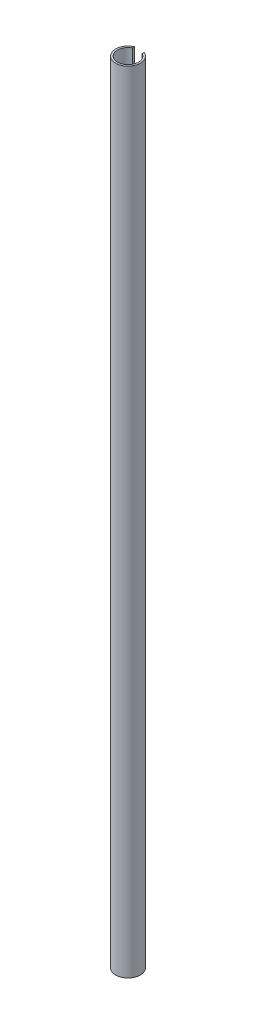
ISO-10303-21;
HEADER;
FILE_DESCRIPTION(('STEP AP214'),'2;1');
FILE_NAME('part.step','',(''),(''),'','','');
FILE_SCHEMA(('AUTOMOTIVE_DESIGN { 1 0 10303 214 1 1 1 1 }'));
ENDSEC;
DATA;
#1=APPLICATION_CONTEXT('core data for automotive mechanical design processes');
#2=APPLICATION_PROTOCOL_DEFINITION('international standard','automotive_design',2000,#1);
#3=PRODUCT_CONTEXT('',#1,'mechanical');
#4=PRODUCT('Part','Part','',(#3));
#5=PRODUCT_RELATED_PRODUCT_CATEGORY('part','',(#4));
#6=PRODUCT_DEFINITION_FORMATION('','',#4);
#7=PRODUCT_DEFINITION_CONTEXT('part definition',#1,'design');
#8=PRODUCT_DEFINITION('design','',#6,#7);
#9=PRODUCT_DEFINITION_SHAPE('','',#8);
#10=(LENGTH_UNIT() NAMED_UNIT(*) SI_UNIT(.MILLI.,.METRE.));
#11=(NAMED_UNIT(*) PLANE_ANGLE_UNIT() SI_UNIT($,.RADIAN.));
#12=(NAMED_UNIT(*) SI_UNIT($,.STERADIAN.) SOLID_ANGLE_UNIT());
#13=UNCERTAINTY_MEASURE_WITH_UNIT(LENGTH_MEASURE(1.E-05),#10,'distance_accuracy_value','');
#14=(GEOMETRIC_REPRESENTATION_CONTEXT(3) GLOBAL_UNCERTAINTY_ASSIGNED_CONTEXT((#13)) GLOBAL_UNIT_ASSIGNED_CONTEXT((#10,
#11,#12)) REPRESENTATION_CONTEXT('',''));
#15=CARTESIAN_POINT('',(0.,0.,0.));
#16=DIRECTION('',(0.,0.,1.));
#17=DIRECTION('',(1.,0.,0.));
#18=AXIS2_PLACEMENT_3D('',#15,#16,#17);
#19=CARTESIAN_POINT('',(0.,-304.8,0.));
#20=DIRECTION('',(0.,1.,0.));
#21=DIRECTION('',(0.,0.,1.));
#22=AXIS2_PLACEMENT_3D('',#19,#20,#21);
#23=CYLINDRICAL_SURFACE('',#22,4.7625);
#24=CARTESIAN_POINT('',(0.,-6.35000000000002,0.));
#25=DIRECTION('',(0.,-1.,0.));
#26=DIRECTION('',(0.,0.,-1.));
#27=AXIS2_PLACEMENT_3D('',#24,#25,#26);
#28=CIRCLE('',#27,4.7625);
#29=CARTESIAN_POINT('',(1.27,-6.35000000000002,-4.5900442535993));
#30=VERTEX_POINT('',#29);
#31=CARTESIAN_POINT('',(-1.27,-6.35,-4.5900442535993));
#32=VERTEX_POINT('',#31);
#33=EDGE_CURVE('E147',#30,#32,#28,.F.);
#34=ORIENTED_EDGE('',*,*,#33,.F.);
#35=CARTESIAN_POINT('',(1.905,-5.715,-4.36490334944544));
#36=CARTESIAN_POINT('',(1.90503800002864,-5.74879900199064,-4.36487550763184));
#37=CARTESIAN_POINT('',(1.90230425531174,-5.78256578385883,-4.36607985594003));
#38=CARTESIAN_POINT('',(1.89160065251299,-5.84898467679265,-4.37073365778045));
#39=CARTESIAN_POINT('',(1.88364892991776,-5.88164023799716,-4.37417533491678));
#40=CARTESIAN_POINT('',(1.86281908756131,-5.94501442064823,-4.38308464775235));
#41=CARTESIAN_POINT('',(1.84994386653643,-5.97573416944238,-4.38855109130008));
#42=CARTESIAN_POINT('',(1.81974028845931,-6.03453620737428,-4.40116126099279));
#43=CARTESIAN_POINT('',(1.80240911607355,-6.06261681369124,-4.40830604729126));
#44=CARTESIAN_POINT('',(1.76303357276742,-6.11662890290227,-4.4242045821498));
#45=CARTESIAN_POINT('',(1.74082421411687,-6.14242387415081,-4.43301256122459));
#46=CARTESIAN_POINT('',(1.69278854194413,-6.18999301552871,-4.45157681831055));
#47=CARTESIAN_POINT('',(1.66696087584477,-6.2117656749683,-4.46133345052315));
#48=CARTESIAN_POINT('',(1.61030361574204,-6.25232677797643,-4.48210922071584));
#49=CARTESIAN_POINT('',(1.57924543193752,-6.27077579529577,-4.49316837521271));
#50=CARTESIAN_POINT('',(1.5144977145548,-6.30214525536181,-4.51540411688492));
#51=CARTESIAN_POINT('',(1.48080874248509,-6.3150668740686,-4.52658067856281));
#52=CARTESIAN_POINT('',(1.41772466091862,-6.33329013537011,-4.54668615696082));
#53=CARTESIAN_POINT('',(1.38861347289046,-6.33953103962582,-4.5556653243771));
#54=CARTESIAN_POINT('',(1.32970189125,-6.34788839302279,-4.57321119814704));
#55=CARTESIAN_POINT('',(1.29990186765957,-6.3500070067277,-4.58177811866035));
#56=CARTESIAN_POINT('',(1.27,-6.35,-4.5900442535993));
#57=B_SPLINE_CURVE_WITH_KNOTS('',3,(#35,#36,#37,#38,#39,#40,#41,#42,#43,#44,#45,#46,#47,#48,#49,
#50,#51,#52,#53,#54,#55,#56),.UNSPECIFIED.,.F.,.F.,(4,2,2,2,2,2,2,2,2,2,4),(0.,
0.101214896403329,0.202079862629373,0.302885535264283,0.40375505554581,0.508787236712468,
0.613858785759235,0.726694912733847,0.839507021745022,0.932522619243278,1.02548936221034),.UNSPECIFIED.);
#58=CARTESIAN_POINT('',(1.905,-5.715,-4.36490334944544));
#59=VERTEX_POINT('',#58);
#60=EDGE_CURVE('E102',#59,#30,#57,.T.);
#61=ORIENTED_EDGE('',*,*,#60,.F.);
#62=DIRECTION('',(0.,1.,0.));
#63=VECTOR('',#62,1.);
#64=CARTESIAN_POINT('',(1.90500000000002,-304.8,-4.36490334944543));
#65=LINE('',#64,#63);
#66=CARTESIAN_POINT('',(1.905,0.,-4.36490334944544));
#67=VERTEX_POINT('',#66);
#68=EDGE_CURVE('E89',#67,#59,#65,.F.);
#69=ORIENTED_EDGE('',*,*,#68,.F.);
#70=CARTESIAN_POINT('',(0.,0.,0.));
#71=DIRECTION('',(0.,1.,0.));
#72=DIRECTION('',(0.,0.,1.));
#73=AXIS2_PLACEMENT_3D('',#70,#71,#72);
#74=CIRCLE('',#73,4.7625);
#75=CARTESIAN_POINT('',(-1.905,0.,-4.36490334944544));
#76=VERTEX_POINT('',#75);
#77=EDGE_CURVE('E100',#76,#67,#74,.T.);
#78=ORIENTED_EDGE('',*,*,#77,.F.);
#79=DIRECTION('',(0.,1.,0.));
#80=VECTOR('',#79,1.);
#81=CARTESIAN_POINT('',(-1.90499999999998,-304.8,-4.36490334944545));
#82=LINE('',#81,#80);
#83=CARTESIAN_POINT('',(-1.905,-5.715,-4.36490334944545));
#84=VERTEX_POINT('',#83);
#85=EDGE_CURVE('E148',#84,#76,#82,.T.);
#86=ORIENTED_EDGE('',*,*,#85,.F.);
#87=CARTESIAN_POINT('',(-1.27,-6.35,-4.5900442535993));
#88=CARTESIAN_POINT('',(-1.30743028935149,-6.35002027004708,-4.5797062055525));
#89=CARTESIAN_POINT('',(-1.34469949158554,-6.34669271583312,-4.56888372852702));
#90=CARTESIAN_POINT('',(-1.41790368380758,-6.33364637474788,-4.54668804550818));
#91=CARTESIAN_POINT('',(-1.45383968988314,-6.32393256542177,-4.53531527481231));
#92=CARTESIAN_POINT('',(-1.52342266456396,-6.29841873885982,-4.51242111997901));
#93=CARTESIAN_POINT('',(-1.55706990409318,-6.28261944345029,-4.50089975362376));
#94=CARTESIAN_POINT('',(-1.62119438507204,-6.24534171130319,-4.47820159949489));
#95=CARTESIAN_POINT('',(-1.65167130633011,-6.22386270170786,-4.46702484660613));
#96=CARTESIAN_POINT('',(-1.70871003914993,-6.17560853350087,-4.44552037060821));
#97=CARTESIAN_POINT('',(-1.73525409786868,-6.14881056541491,-4.43519658519313));
#98=CARTESIAN_POINT('',(-1.78339383593601,-6.09060170400478,-4.41605991992178));
#99=CARTESIAN_POINT('',(-1.80498986446577,-6.05919113644739,-4.40724693345989));
#100=CARTESIAN_POINT('',(-1.84149271758497,-5.99418633029293,-4.39211614149731));
#101=CARTESIAN_POINT('',(-1.85666775142898,-5.96076579426649,-4.38569998591317));
#102=CARTESIAN_POINT('',(-1.88107873790394,-5.89149403745904,-4.37528604139458));
#103=CARTESIAN_POINT('',(-1.89032536453664,-5.85564731442351,-4.37128390682803));
#104=CARTESIAN_POINT('',(-1.89925247545882,-5.80201774415863,-4.36740822443793));
#105=CARTESIAN_POINT('',(-1.90140609266565,-5.784688525274,-4.36647050339013));
#106=CARTESIAN_POINT('',(-1.90427918763857,-5.74990962201361,-4.36521802598698));
#107=CARTESIAN_POINT('',(-1.90500032543591,-5.73246010062041,-4.36490254854654));
#108=CARTESIAN_POINT('',(-1.905,-5.715,-4.36490334944544));
#109=B_SPLINE_CURVE_WITH_KNOTS('',3,(#87,#88,#89,#90,#91,#92,#93,#94,#95,#96,#97,#98,#99,#100,
#101,#102,#103,#104,#105,#106,#107,#108),.UNSPECIFIED.,.F.,.F.,(4,2,2,2,2,2,2,2,2,2,4),(0.,
0.116313306071376,0.232536063073277,0.348745038625052,0.464965739524027,0.581696042350367,
0.698418105011242,0.809616036110505,0.920613190677826,0.973015841688996,1.02535773028726),.UNSPECIFIED.);
#110=EDGE_CURVE('E141',#32,#84,#109,.T.);
#111=ORIENTED_EDGE('',*,*,#110,.F.);
#112=EDGE_LOOP('',(#34,#61,#69,#78,#86,#111));
#113=FACE_BOUND('',#112,.T.);
#114=CARTESIAN_POINT('',(0.,-304.8,0.));
#115=DIRECTION('',(0.,1.,0.));
#116=DIRECTION('',(0.,0.,1.));
#117=AXIS2_PLACEMENT_3D('',#114,#115,#116);
#118=CIRCLE('',#117,4.7625);
#119=CARTESIAN_POINT('',(0.,-304.8,4.7625));
#120=VERTEX_POINT('',#119);
#121=EDGE_CURVE('E106',#120,#120,#118,.T.);
#122=ORIENTED_EDGE('',*,*,#121,.T.);
#123=EDGE_LOOP('',(#122));
#124=FACE_BOUND('',#123,.T.);
#125=ADVANCED_FACE('F33',(#113,#124),#23,.T.);
#126=CARTESIAN_POINT('',(0.,-304.8,0.));
#127=DIRECTION('',(0.,1.,0.));
#128=DIRECTION('',(0.,0.,1.));
#129=AXIS2_PLACEMENT_3D('',#126,#127,#128);
#130=PLANE('',#129);
#131=CARTESIAN_POINT('',(0.,-304.8,0.));
#132=DIRECTION('',(0.,1.,0.));
#133=DIRECTION('',(0.,0.,1.));
#134=AXIS2_PLACEMENT_3D('',#131,#132,#133);
#135=CIRCLE('',#134,4.0513);
#136=CARTESIAN_POINT('',(0.,-304.8,4.0513));
#137=VERTEX_POINT('',#136);
#138=EDGE_CURVE('E107',#137,#137,#135,.T.);
#139=ORIENTED_EDGE('',*,*,#138,.T.);
#140=EDGE_LOOP('',(#139));
#141=FACE_BOUND('',#140,.T.);
#142=ORIENTED_EDGE('',*,*,#121,.F.);
#143=EDGE_LOOP('',(#142));
#144=FACE_BOUND('',#143,.T.);
#145=ADVANCED_FACE('F182',(#141,#144),#130,.F.);
#146=CARTESIAN_POINT('',(0.,0.,0.));
#147=DIRECTION('',(0.,1.,0.));
#148=DIRECTION('',(0.,0.,1.));
#149=AXIS2_PLACEMENT_3D('',#146,#147,#148);
#150=PLANE('',#149);
#151=DIRECTION('',(0.,0.,1.));
#152=VECTOR('',#151,1.);
#153=CARTESIAN_POINT('',(1.905,0.,-4.7625));
#154=LINE('',#153,#152);
#155=CARTESIAN_POINT('',(1.905,0.,-3.57547293235454));
#156=VERTEX_POINT('',#155);
#157=EDGE_CURVE('E86',#67,#156,#154,.T.);
#158=ORIENTED_EDGE('',*,*,#157,.T.);
#159=CARTESIAN_POINT('',(0.,0.,0.));
#160=DIRECTION('',(0.,1.,0.));
#161=DIRECTION('',(0.,0.,1.));
#162=AXIS2_PLACEMENT_3D('',#159,#160,#161);
#163=CIRCLE('',#162,4.0513);
#164=CARTESIAN_POINT('',(-1.905,0.,-3.57547293235454));
#165=VERTEX_POINT('',#164);
#166=EDGE_CURVE('E103',#165,#156,#163,.T.);
#167=ORIENTED_EDGE('',*,*,#166,.F.);
#168=DIRECTION('',(0.,0.,1.));
#169=VECTOR('',#168,1.);
#170=CARTESIAN_POINT('',(-1.905,0.,-4.7625));
#171=LINE('',#170,#169);
#172=EDGE_CURVE('E48',#76,#165,#171,.T.);
#173=ORIENTED_EDGE('',*,*,#172,.F.);
#174=ORIENTED_EDGE('',*,*,#77,.T.);
#175=EDGE_LOOP('',(#158,#167,#173,#174));
#176=FACE_BOUND('',#175,.T.);
#177=ADVANCED_FACE('F105',(#176),#150,.T.);
#178=CARTESIAN_POINT('',(0.,-304.8,0.));
#179=DIRECTION('',(0.,1.,0.));
#180=DIRECTION('',(0.,0.,1.));
#181=AXIS2_PLACEMENT_3D('',#178,#179,#180);
#182=CYLINDRICAL_SURFACE('',#181,4.0513);
#183=ORIENTED_EDGE('',*,*,#138,.F.);
#184=EDGE_LOOP('',(#183));
#185=FACE_BOUND('',#184,.T.);
#186=ORIENTED_EDGE('',*,*,#166,.T.);
#187=DIRECTION('',(0.,1.,0.));
#188=VECTOR('',#187,1.);
#189=CARTESIAN_POINT('',(1.90500000000002,-304.8,-3.57547293235453));
#190=LINE('',#189,#188);
#191=CARTESIAN_POINT('',(1.905,-5.715,-3.57547293235454));
#192=VERTEX_POINT('',#191);
#193=EDGE_CURVE('E11',#156,#192,#190,.F.);
#194=ORIENTED_EDGE('',*,*,#193,.T.);
#195=CARTESIAN_POINT('',(1.905,-5.715,-3.57547293235454));
#196=CARTESIAN_POINT('',(1.90504039861179,-5.74803288245156,-3.57543821350671));
#197=CARTESIAN_POINT('',(1.90242548363459,-5.78102394747874,-3.57684470203189));
#198=CARTESIAN_POINT('',(1.89222031939552,-5.84586195502893,-3.58226067301751));
#199=CARTESIAN_POINT('',(1.88465240593976,-5.87771336002885,-3.58625846906678));
#200=CARTESIAN_POINT('',(1.8648815438911,-5.93949151528157,-3.59657676060465));
#201=CARTESIAN_POINT('',(1.85268344090133,-5.96942023950986,-3.60289482765069));
#202=CARTESIAN_POINT('',(1.8241358000363,-6.02674405965737,-3.6174325216798));
#203=CARTESIAN_POINT('',(1.80778237995978,-6.05413675339831,-3.62565392625808));
#204=CARTESIAN_POINT('',(1.77041714611142,-6.10733094796584,-3.64405143437242));
#205=CARTESIAN_POINT('',(1.74919376283154,-6.13295414182241,-3.65431194317989));
#206=CARTESIAN_POINT('',(1.7033019424958,-6.18036436729227,-3.67592680922676));
#207=CARTESIAN_POINT('',(1.67863209912682,-6.20214982468775,-3.68728161239865));
#208=CARTESIAN_POINT('',(1.62366040611435,-6.24363656754856,-3.71183993308898));
#209=CARTESIAN_POINT('',(1.59303890140429,-6.26287454872325,-3.72511203045978));
#210=CARTESIAN_POINT('',(1.52905064931103,-6.29587332189441,-3.75183143582545));
#211=CARTESIAN_POINT('',(1.49568407271606,-6.30963445432966,-3.76527873287629));
#212=CARTESIAN_POINT('',(1.43060376687918,-6.33019870072333,-3.79044642836751));
#213=CARTESIAN_POINT('',(1.39908497063336,-6.33758115726066,-3.80219976852002));
#214=CARTESIAN_POINT('',(1.33509977497431,-6.34748548909009,-3.82514318509093));
#215=CARTESIAN_POINT('',(1.30263347406182,-6.35000786781213,-3.83633331973188));
#216=CARTESIAN_POINT('',(1.27,-6.35,-3.84709392788895));
#217=B_SPLINE_CURVE_WITH_KNOTS('',3,(#195,#196,#197,#198,#199,#200,#201,#202,#203,#204,#205,
#206,#207,#208,#209,#210,#211,#212,#213,#214,#215,#216),.UNSPECIFIED.,.F.,.F.,(4,2,2,2,2,2,2,2,
2,2,4),(0.,0.0988997143645777,0.197356480157777,0.295710491426492,0.394156732260834,
0.498185332526309,0.60225650587351,0.717321926231686,0.832380193050543,0.935344125290909,
1.03829739146459),.UNSPECIFIED.);
#218=CARTESIAN_POINT('',(1.27,-6.35000000000002,-3.84709392788895));
#219=VERTEX_POINT('',#218);
#220=EDGE_CURVE('E41',#192,#219,#217,.T.);
#221=ORIENTED_EDGE('',*,*,#220,.T.);
#222=CARTESIAN_POINT('',(0.,-6.35000000000002,0.));
#223=DIRECTION('',(0.,-1.,0.));
#224=DIRECTION('',(0.,0.,-1.));
#225=AXIS2_PLACEMENT_3D('',#222,#223,#224);
#226=CIRCLE('',#225,4.0513);
#227=CARTESIAN_POINT('',(-1.27,-6.35,-3.84709392788895));
#228=VERTEX_POINT('',#227);
#229=EDGE_CURVE('E125',#219,#228,#226,.F.);
#230=ORIENTED_EDGE('',*,*,#229,.T.);
#231=CARTESIAN_POINT('',(-1.27,-6.35,-3.84709392788895));
#232=CARTESIAN_POINT('',(-1.30814788633148,-6.35001529253405,-3.83452365431606));
#233=CARTESIAN_POINT('',(-1.34606186237617,-6.34656486979824,-3.82135610235382));
#234=CARTESIAN_POINT('',(-1.42041296091237,-6.33307874571827,-3.7943345358371));
#235=CARTESIAN_POINT('',(-1.45685135275175,-6.32304883777852,-3.78048113510234));
#236=CARTESIAN_POINT('',(-1.52729856794665,-6.29675402249335,-3.75257773892916));
#237=CARTESIAN_POINT('',(-1.56130836484603,-6.28049163038083,-3.73852782499825));
#238=CARTESIAN_POINT('',(-1.62605842490745,-6.24212735171267,-3.71082246254784));
#239=CARTESIAN_POINT('',(-1.65679773908688,-6.22002377669142,-3.69716712935492));
#240=CARTESIAN_POINT('',(-1.71434939513815,-6.17023375639269,-3.67083761052675));
#241=CARTESIAN_POINT('',(-1.74112959345998,-6.14250553427982,-3.65817181191654));
#242=CARTESIAN_POINT('',(-1.78953840348352,-6.08214968719309,-3.6347364048787));
#243=CARTESIAN_POINT('',(-1.81116820480734,-6.04952319644981,-3.62396635872644));
#244=CARTESIAN_POINT('',(-1.84703203529982,-5.98258576847389,-3.60581230139251));
#245=CARTESIAN_POINT('',(-1.86166904236585,-5.94854035065519,-3.59824780533152));
#246=CARTESIAN_POINT('',(-1.88484937515938,-5.8779610265659,-3.58616076380926));
#247=CARTESIAN_POINT('',(-1.89340744514519,-5.84143337851186,-3.58163085957757));
#248=CARTESIAN_POINT('',(-1.90078296974932,-5.78958296904703,-3.57771712754499));
#249=CARTESIAN_POINT('',(-1.90236321294661,-5.77471560188377,-3.57687678915202));
#250=CARTESIAN_POINT('',(-1.90447091891016,-5.74490182936433,-3.5757549413462));
#251=CARTESIAN_POINT('',(-1.9049995277865,-5.72995552787223,-3.57547282356564));
#252=CARTESIAN_POINT('',(-1.905,-5.715,-3.57547293235454));
#253=B_SPLINE_CURVE_WITH_KNOTS('',3,(#231,#232,#233,#234,#235,#236,#237,#238,#239,#240,#241,
#242,#243,#244,#245,#246,#247,#248,#249,#250,#251,#252),.UNSPECIFIED.,.F.,.F.,(4,2,2,2,2,2,2,2,
2,2,4),(0.,0.120295431568416,0.240485081867348,0.360626278426203,0.480802241331676,
0.601905834615342,0.722981428588418,0.835821664068431,0.94838726603688,0.993272648728932,
1.0381090868102),.UNSPECIFIED.);
#254=CARTESIAN_POINT('',(-1.905,-5.715,-3.57547293235456));
#255=VERTEX_POINT('',#254);
#256=EDGE_CURVE('E117',#228,#255,#253,.T.);
#257=ORIENTED_EDGE('',*,*,#256,.T.);
#258=DIRECTION('',(0.,1.,0.));
#259=VECTOR('',#258,1.);
#260=CARTESIAN_POINT('',(-1.90499999999998,-304.8,-3.57547293235456));
#261=LINE('',#260,#259);
#262=EDGE_CURVE('E110',#255,#165,#261,.T.);
#263=ORIENTED_EDGE('',*,*,#262,.T.);
#264=EDGE_LOOP('',(#186,#194,#221,#230,#257,#263));
#265=FACE_BOUND('',#264,.T.);
#266=ADVANCED_FACE('F126',(#185,#265),#182,.F.);
#267=CARTESIAN_POINT('',(1.905,-5.715,-4.7625));
#268=DIRECTION('',(1.,0.,0.));
#269=DIRECTION('',(0.,1.,0.));
#270=AXIS2_PLACEMENT_3D('',#267,#268,#269);
#271=PLANE('',#270);
#272=ORIENTED_EDGE('',*,*,#68,.T.);
#273=DIRECTION('',(0.,0.,1.));
#274=VECTOR('',#273,1.);
#275=CARTESIAN_POINT('',(1.905,-5.715,-4.7625));
#276=LINE('',#275,#274);
#277=EDGE_CURVE('E168',#59,#192,#276,.T.);
#278=ORIENTED_EDGE('',*,*,#277,.T.);
#279=ORIENTED_EDGE('',*,*,#193,.F.);
#280=ORIENTED_EDGE('',*,*,#157,.F.);
#281=EDGE_LOOP('',(#272,#278,#279,#280));
#282=FACE_BOUND('',#281,.T.);
#283=ADVANCED_FACE('F88',(#282),#271,.F.);
#284=CARTESIAN_POINT('',(1.27,-5.715,-4.7625));
#285=DIRECTION('',(0.,0.,1.));
#286=DIRECTION('',(1.,0.,0.));
#287=AXIS2_PLACEMENT_3D('',#284,#285,#286);
#288=CYLINDRICAL_SURFACE('',#287,0.635);
#289=ORIENTED_EDGE('',*,*,#60,.T.);
#290=DIRECTION('',(0.,0.,1.));
#291=VECTOR('',#290,1.);
#292=CARTESIAN_POINT('',(1.27,-6.35,-4.7625));
#293=LINE('',#292,#291);
#294=EDGE_CURVE('E165',#30,#219,#293,.T.);
#295=ORIENTED_EDGE('',*,*,#294,.T.);
#296=ORIENTED_EDGE('',*,*,#220,.F.);
#297=ORIENTED_EDGE('',*,*,#277,.F.);
#298=EDGE_LOOP('',(#289,#295,#296,#297));
#299=FACE_BOUND('',#298,.T.);
#300=ADVANCED_FACE('F153',(#299),#288,.F.);
#301=CARTESIAN_POINT('',(-1.27,-6.35,-4.7625));
#302=DIRECTION('',(0.,-1.,0.));
#303=DIRECTION('',(0.,0.,-1.));
#304=AXIS2_PLACEMENT_3D('',#301,#302,#303);
#305=PLANE('',#304);
#306=ORIENTED_EDGE('',*,*,#33,.T.);
#307=DIRECTION('',(0.,0.,1.));
#308=VECTOR('',#307,1.);
#309=CARTESIAN_POINT('',(-1.27,-6.35,-4.7625));
#310=LINE('',#309,#308);
#311=EDGE_CURVE('E167',#32,#228,#310,.T.);
#312=ORIENTED_EDGE('',*,*,#311,.T.);
#313=ORIENTED_EDGE('',*,*,#229,.F.);
#314=ORIENTED_EDGE('',*,*,#294,.F.);
#315=EDGE_LOOP('',(#306,#312,#313,#314));
#316=FACE_BOUND('',#315,.T.);
#317=ADVANCED_FACE('F136',(#316),#305,.F.);
#318=CARTESIAN_POINT('',(-1.27,-5.715,-4.7625));
#319=DIRECTION('',(0.,0.,1.));
#320=DIRECTION('',(1.,0.,0.));
#321=AXIS2_PLACEMENT_3D('',#318,#319,#320);
#322=CYLINDRICAL_SURFACE('',#321,0.635);
#323=ORIENTED_EDGE('',*,*,#110,.T.);
#324=DIRECTION('',(0.,0.,1.));
#325=VECTOR('',#324,1.);
#326=CARTESIAN_POINT('',(-1.905,-5.715,-4.7625));
#327=LINE('',#326,#325);
#328=EDGE_CURVE('E171',#84,#255,#327,.T.);
#329=ORIENTED_EDGE('',*,*,#328,.T.);
#330=ORIENTED_EDGE('',*,*,#256,.F.);
#331=ORIENTED_EDGE('',*,*,#311,.F.);
#332=EDGE_LOOP('',(#323,#329,#330,#331));
#333=FACE_BOUND('',#332,.T.);
#334=ADVANCED_FACE('F130',(#333),#322,.F.);
#335=CARTESIAN_POINT('',(-1.905,-5.715,-4.7625));
#336=DIRECTION('',(-1.,0.,0.));
#337=DIRECTION('',(0.,-1.,0.));
#338=AXIS2_PLACEMENT_3D('',#335,#336,#337);
#339=PLANE('',#338);
#340=ORIENTED_EDGE('',*,*,#85,.T.);
#341=ORIENTED_EDGE('',*,*,#172,.T.);
#342=ORIENTED_EDGE('',*,*,#262,.F.);
#343=ORIENTED_EDGE('',*,*,#328,.F.);
#344=EDGE_LOOP('',(#340,#341,#342,#343));
#345=FACE_BOUND('',#344,.T.);
#346=ADVANCED_FACE('F135',(#345),#339,.F.);
#347=CLOSED_SHELL('',(#125,#145,#177,#266,#283,#300,#317,#334,#346));
#348=MANIFOLD_SOLID_BREP('B2',#347);
#349=ADVANCED_BREP_SHAPE_REPRESENTATION('',(#18,#348),#14);
#350=SHAPE_DEFINITION_REPRESENTATION(#9,#349);
ENDSEC;
END-ISO-10303-21;
